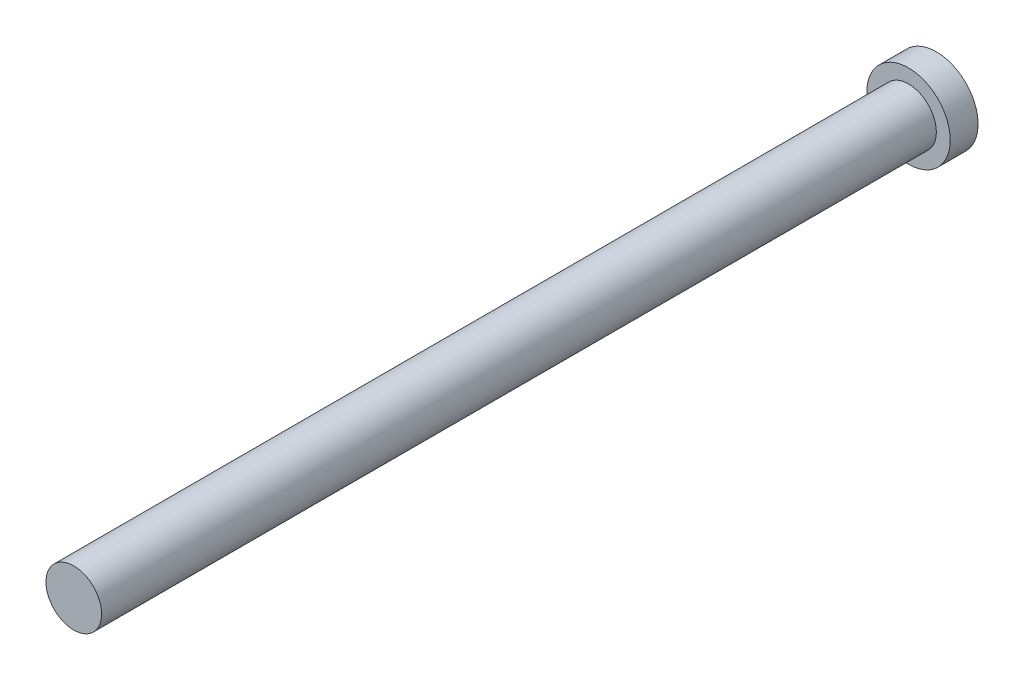
ISO-10303-21;
HEADER;
FILE_DESCRIPTION(('STEP AP214'),'2;1');
FILE_NAME('part.step','',(''),(''),'','','');
FILE_SCHEMA(('AUTOMOTIVE_DESIGN { 1 0 10303 214 1 1 1 1 }'));
ENDSEC;
DATA;
#1=APPLICATION_CONTEXT('core data for automotive mechanical design processes');
#2=APPLICATION_PROTOCOL_DEFINITION('international standard','automotive_design',2000,#1);
#3=PRODUCT_CONTEXT('',#1,'mechanical');
#4=PRODUCT('Part','Part','',(#3));
#5=PRODUCT_RELATED_PRODUCT_CATEGORY('part','',(#4));
#6=PRODUCT_DEFINITION_FORMATION('','',#4);
#7=PRODUCT_DEFINITION_CONTEXT('part definition',#1,'design');
#8=PRODUCT_DEFINITION('design','',#6,#7);
#9=PRODUCT_DEFINITION_SHAPE('','',#8);
#10=(LENGTH_UNIT() NAMED_UNIT(*) SI_UNIT(.MILLI.,.METRE.));
#11=(NAMED_UNIT(*) PLANE_ANGLE_UNIT() SI_UNIT($,.RADIAN.));
#12=(NAMED_UNIT(*) SI_UNIT($,.STERADIAN.) SOLID_ANGLE_UNIT());
#13=UNCERTAINTY_MEASURE_WITH_UNIT(LENGTH_MEASURE(1.E-05),#10,'distance_accuracy_value','');
#14=(GEOMETRIC_REPRESENTATION_CONTEXT(3) GLOBAL_UNCERTAINTY_ASSIGNED_CONTEXT((#13)) GLOBAL_UNIT_ASSIGNED_CONTEXT((#10,
#11,#12)) REPRESENTATION_CONTEXT('',''));
#15=CARTESIAN_POINT('',(0.,0.,0.));
#16=DIRECTION('',(0.,0.,1.));
#17=DIRECTION('',(1.,0.,0.));
#18=AXIS2_PLACEMENT_3D('',#15,#16,#17);
#19=CARTESIAN_POINT('',(0.,0.,60.));
#20=DIRECTION('',(0.,0.,-1.));
#21=DIRECTION('',(-1.,0.,0.));
#22=AXIS2_PLACEMENT_3D('',#19,#20,#21);
#23=CYLINDRICAL_SURFACE('',#22,2.);
#24=CARTESIAN_POINT('',(0.,0.,60.));
#25=DIRECTION('',(0.,0.,1.));
#26=DIRECTION('',(1.,0.,0.));
#27=AXIS2_PLACEMENT_3D('',#24,#25,#26);
#28=CIRCLE('',#27,2.);
#29=CARTESIAN_POINT('',(2.,0.,60.));
#30=VERTEX_POINT('',#29);
#31=EDGE_CURVE('E10',#30,#30,#28,.T.);
#32=ORIENTED_EDGE('',*,*,#31,.F.);
#33=EDGE_LOOP('',(#32));
#34=FACE_BOUND('',#33,.T.);
#35=CARTESIAN_POINT('',(0.,0.,0.));
#36=DIRECTION('',(0.,0.,1.));
#37=DIRECTION('',(1.,0.,0.));
#38=AXIS2_PLACEMENT_3D('',#35,#36,#37);
#39=CIRCLE('',#38,2.);
#40=CARTESIAN_POINT('',(2.,0.,0.));
#41=VERTEX_POINT('',#40);
#42=EDGE_CURVE('E40',#41,#41,#39,.T.);
#43=ORIENTED_EDGE('',*,*,#42,.T.);
#44=EDGE_LOOP('',(#43));
#45=FACE_BOUND('',#44,.T.);
#46=ADVANCED_FACE('F37',(#34,#45),#23,.T.);
#47=CARTESIAN_POINT('',(0.,0.,60.));
#48=DIRECTION('',(0.,0.,1.));
#49=DIRECTION('',(1.,0.,0.));
#50=AXIS2_PLACEMENT_3D('',#47,#48,#49);
#51=PLANE('',#50);
#52=ORIENTED_EDGE('',*,*,#31,.T.);
#53=EDGE_LOOP('',(#52));
#54=FACE_BOUND('',#53,.T.);
#55=ADVANCED_FACE('F64',(#54),#51,.T.);
#56=CARTESIAN_POINT('',(0.,0.,-2.));
#57=DIRECTION('',(0.,0.,1.));
#58=DIRECTION('',(1.,0.,0.));
#59=AXIS2_PLACEMENT_3D('',#56,#57,#58);
#60=CYLINDRICAL_SURFACE('',#59,3.);
#61=CARTESIAN_POINT('',(0.,0.,-2.));
#62=DIRECTION('',(0.,0.,-1.));
#63=DIRECTION('',(-1.,0.,0.));
#64=AXIS2_PLACEMENT_3D('',#61,#62,#63);
#65=CIRCLE('',#64,3.);
#66=CARTESIAN_POINT('',(-3.,0.,-2.));
#67=VERTEX_POINT('',#66);
#68=EDGE_CURVE('E49',#67,#67,#65,.T.);
#69=ORIENTED_EDGE('',*,*,#68,.F.);
#70=EDGE_LOOP('',(#69));
#71=FACE_BOUND('',#70,.T.);
#72=CARTESIAN_POINT('',(0.,0.,0.));
#73=DIRECTION('',(0.,0.,-1.));
#74=DIRECTION('',(-1.,0.,0.));
#75=AXIS2_PLACEMENT_3D('',#72,#73,#74);
#76=CIRCLE('',#75,3.);
#77=CARTESIAN_POINT('',(-3.,0.,0.));
#78=VERTEX_POINT('',#77);
#79=EDGE_CURVE('E51',#78,#78,#76,.T.);
#80=ORIENTED_EDGE('',*,*,#79,.T.);
#81=EDGE_LOOP('',(#80));
#82=FACE_BOUND('',#81,.T.);
#83=ADVANCED_FACE('F61',(#71,#82),#60,.T.);
#84=CARTESIAN_POINT('',(0.,0.,-2.));
#85=DIRECTION('',(0.,0.,-1.));
#86=DIRECTION('',(-1.,0.,0.));
#87=AXIS2_PLACEMENT_3D('',#84,#85,#86);
#88=PLANE('',#87);
#89=ORIENTED_EDGE('',*,*,#68,.T.);
#90=EDGE_LOOP('',(#89));
#91=FACE_BOUND('',#90,.T.);
#92=ADVANCED_FACE('F59',(#91),#88,.T.);
#93=CARTESIAN_POINT('',(0.,0.,0.));
#94=DIRECTION('',(0.,0.,-1.));
#95=DIRECTION('',(-1.,0.,0.));
#96=AXIS2_PLACEMENT_3D('',#93,#94,#95);
#97=PLANE('',#96);
#98=ORIENTED_EDGE('',*,*,#42,.F.);
#99=EDGE_LOOP('',(#98));
#100=FACE_BOUND('',#99,.T.);
#101=ORIENTED_EDGE('',*,*,#79,.F.);
#102=EDGE_LOOP('',(#101));
#103=FACE_BOUND('',#102,.T.);
#104=ADVANCED_FACE('F68',(#100,#103),#97,.F.);
#105=CLOSED_SHELL('',(#46,#55,#83,#92,#104));
#106=MANIFOLD_SOLID_BREP('B2',#105);
#107=ADVANCED_BREP_SHAPE_REPRESENTATION('',(#18,#106),#14);
#108=SHAPE_DEFINITION_REPRESENTATION(#9,#107);
ENDSEC;
END-ISO-10303-21;
